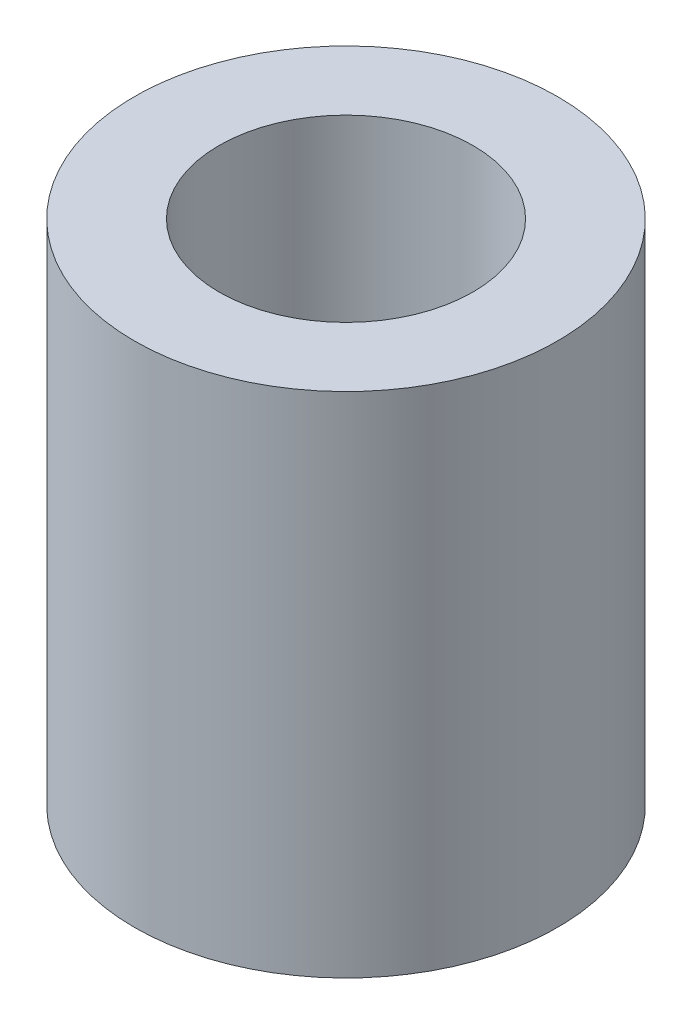
ISO-10303-21;
HEADER;
FILE_DESCRIPTION(('STEP AP214'),'2;1');
FILE_NAME('part.step','',(''),(''),'','','');
FILE_SCHEMA(('AUTOMOTIVE_DESIGN { 1 0 10303 214 1 1 1 1 }'));
ENDSEC;
DATA;
#1=APPLICATION_CONTEXT('core data for automotive mechanical design processes');
#2=APPLICATION_PROTOCOL_DEFINITION('international standard','automotive_design',2000,#1);
#3=PRODUCT_CONTEXT('',#1,'mechanical');
#4=PRODUCT('Part','Part','',(#3));
#5=PRODUCT_RELATED_PRODUCT_CATEGORY('part','',(#4));
#6=PRODUCT_DEFINITION_FORMATION('','',#4);
#7=PRODUCT_DEFINITION_CONTEXT('part definition',#1,'design');
#8=PRODUCT_DEFINITION('design','',#6,#7);
#9=PRODUCT_DEFINITION_SHAPE('','',#8);
#10=(LENGTH_UNIT() NAMED_UNIT(*) SI_UNIT(.MILLI.,.METRE.));
#11=(NAMED_UNIT(*) PLANE_ANGLE_UNIT() SI_UNIT($,.RADIAN.));
#12=(NAMED_UNIT(*) SI_UNIT($,.STERADIAN.) SOLID_ANGLE_UNIT());
#13=UNCERTAINTY_MEASURE_WITH_UNIT(LENGTH_MEASURE(1.E-05),#10,'distance_accuracy_value','');
#14=(GEOMETRIC_REPRESENTATION_CONTEXT(3) GLOBAL_UNCERTAINTY_ASSIGNED_CONTEXT((#13)) GLOBAL_UNIT_ASSIGNED_CONTEXT((#10,
#11,#12)) REPRESENTATION_CONTEXT('',''));
#15=CARTESIAN_POINT('',(0.,0.,0.));
#16=DIRECTION('',(0.,0.,1.));
#17=DIRECTION('',(1.,0.,0.));
#18=AXIS2_PLACEMENT_3D('',#15,#16,#17);
#19=CARTESIAN_POINT('',(0.,10.,0.));
#20=DIRECTION('',(0.,1.,0.));
#21=DIRECTION('',(0.,0.,1.));
#22=AXIS2_PLACEMENT_3D('',#19,#20,#21);
#23=PLANE('',#22);
#24=CARTESIAN_POINT('',(0.,10.,0.));
#25=DIRECTION('',(0.,1.,0.));
#26=DIRECTION('',(0.,0.,1.));
#27=AXIS2_PLACEMENT_3D('',#24,#25,#26);
#28=CIRCLE('',#27,5.);
#29=CARTESIAN_POINT('',(0.,10.,5.));
#30=VERTEX_POINT('',#29);
#31=EDGE_CURVE('E10',#30,#30,#28,.T.);
#32=ORIENTED_EDGE('',*,*,#31,.T.);
#33=EDGE_LOOP('',(#32));
#34=FACE_BOUND('',#33,.T.);
#35=CARTESIAN_POINT('',(0.,10.,0.));
#36=DIRECTION('',(0.,1.,0.));
#37=DIRECTION('',(0.,0.,1.));
#38=AXIS2_PLACEMENT_3D('',#35,#36,#37);
#39=CIRCLE('',#38,3.);
#40=CARTESIAN_POINT('',(0.,10.,3.));
#41=VERTEX_POINT('',#40);
#42=EDGE_CURVE('E45',#41,#41,#39,.T.);
#43=ORIENTED_EDGE('',*,*,#42,.F.);
#44=EDGE_LOOP('',(#43));
#45=FACE_BOUND('',#44,.T.);
#46=ADVANCED_FACE('F37',(#34,#45),#23,.T.);
#47=CARTESIAN_POINT('',(0.,10.,0.));
#48=DIRECTION('',(0.,-1.,0.));
#49=DIRECTION('',(0.,0.,-1.));
#50=AXIS2_PLACEMENT_3D('',#47,#48,#49);
#51=CYLINDRICAL_SURFACE('',#50,5.);
#52=ORIENTED_EDGE('',*,*,#31,.F.);
#53=EDGE_LOOP('',(#52));
#54=FACE_BOUND('',#53,.T.);
#55=CARTESIAN_POINT('',(0.,-2.,0.));
#56=DIRECTION('',(0.,-1.,0.));
#57=DIRECTION('',(0.,0.,-1.));
#58=AXIS2_PLACEMENT_3D('',#55,#56,#57);
#59=CIRCLE('',#58,5.);
#60=CARTESIAN_POINT('',(0.,-2.,-5.));
#61=VERTEX_POINT('',#60);
#62=EDGE_CURVE('E56',#61,#61,#59,.T.);
#63=ORIENTED_EDGE('',*,*,#62,.F.);
#64=EDGE_LOOP('',(#63));
#65=FACE_BOUND('',#64,.T.);
#66=ADVANCED_FACE('F39',(#54,#65),#51,.T.);
#67=CARTESIAN_POINT('',(0.,10.,0.));
#68=DIRECTION('',(0.,-1.,0.));
#69=DIRECTION('',(0.,0.,-1.));
#70=AXIS2_PLACEMENT_3D('',#67,#68,#69);
#71=CYLINDRICAL_SURFACE('',#70,3.);
#72=ORIENTED_EDGE('',*,*,#42,.T.);
#73=EDGE_LOOP('',(#72));
#74=FACE_BOUND('',#73,.T.);
#75=CARTESIAN_POINT('',(0.,0.,0.));
#76=DIRECTION('',(0.,1.,0.));
#77=DIRECTION('',(0.,0.,1.));
#78=AXIS2_PLACEMENT_3D('',#75,#76,#77);
#79=CIRCLE('',#78,3.);
#80=CARTESIAN_POINT('',(0.,0.,3.));
#81=VERTEX_POINT('',#80);
#82=EDGE_CURVE('E50',#81,#81,#79,.T.);
#83=ORIENTED_EDGE('',*,*,#82,.F.);
#84=EDGE_LOOP('',(#83));
#85=FACE_BOUND('',#84,.T.);
#86=ADVANCED_FACE('F65',(#74,#85),#71,.F.);
#87=CARTESIAN_POINT('',(0.,0.,0.));
#88=DIRECTION('',(0.,-1.,0.));
#89=DIRECTION('',(0.,0.,-1.));
#90=AXIS2_PLACEMENT_3D('',#87,#88,#89);
#91=PLANE('',#90);
#92=ORIENTED_EDGE('',*,*,#82,.T.);
#93=EDGE_LOOP('',(#92));
#94=FACE_BOUND('',#93,.T.);
#95=ADVANCED_FACE('F71',(#94),#91,.F.);
#96=CARTESIAN_POINT('',(0.,-2.,0.));
#97=DIRECTION('',(0.,-1.,0.));
#98=DIRECTION('',(0.,0.,-1.));
#99=AXIS2_PLACEMENT_3D('',#96,#97,#98);
#100=PLANE('',#99);
#101=ORIENTED_EDGE('',*,*,#62,.T.);
#102=EDGE_LOOP('',(#101));
#103=FACE_BOUND('',#102,.T.);
#104=ADVANCED_FACE('F62',(#103),#100,.T.);
#105=CLOSED_SHELL('',(#46,#66,#86,#95,#104));
#106=MANIFOLD_SOLID_BREP('B2',#105);
#107=ADVANCED_BREP_SHAPE_REPRESENTATION('',(#18,#106),#14);
#108=SHAPE_DEFINITION_REPRESENTATION(#9,#107);
ENDSEC;
END-ISO-10303-21;
